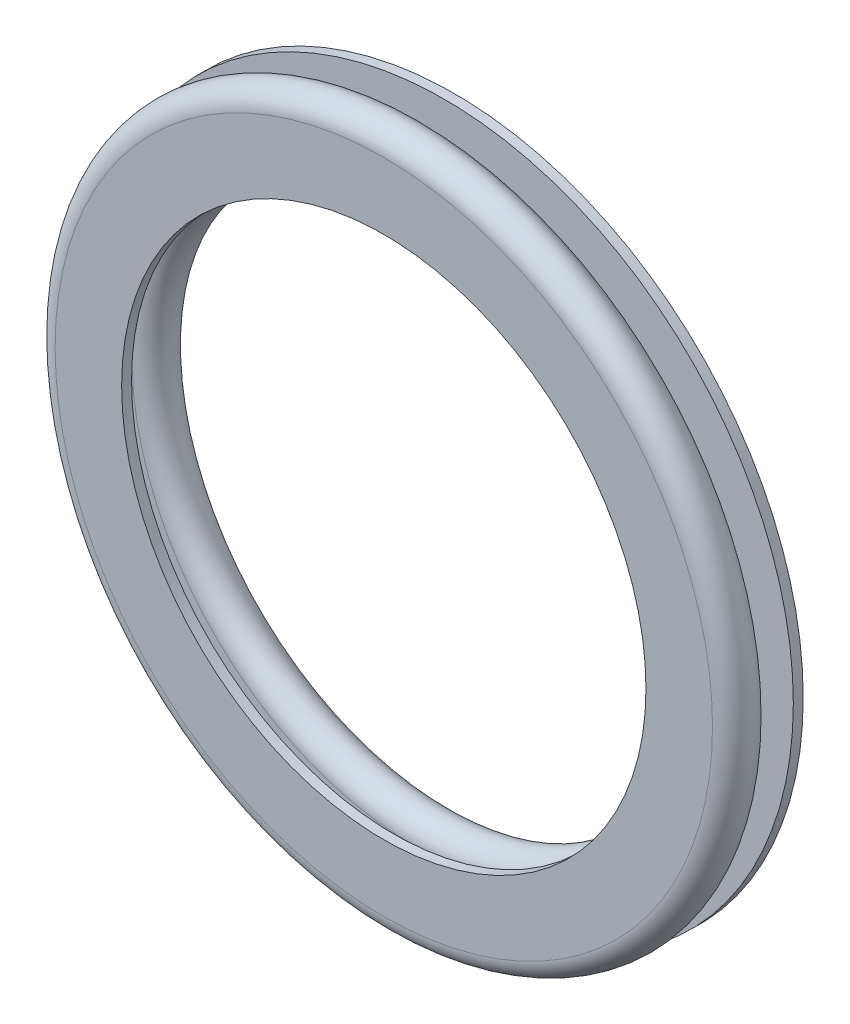
ISO-10303-21;
HEADER;
FILE_DESCRIPTION(('STEP AP214'),'2;1');
FILE_NAME('part.step','',(''),(''),'','','');
FILE_SCHEMA(('AUTOMOTIVE_DESIGN { 1 0 10303 214 1 1 1 1 }'));
ENDSEC;
DATA;
#1=APPLICATION_CONTEXT('core data for automotive mechanical design processes');
#2=APPLICATION_PROTOCOL_DEFINITION('international standard','automotive_design',2000,#1);
#3=PRODUCT_CONTEXT('',#1,'mechanical');
#4=PRODUCT('Part','Part','',(#3));
#5=PRODUCT_RELATED_PRODUCT_CATEGORY('part','',(#4));
#6=PRODUCT_DEFINITION_FORMATION('','',#4);
#7=PRODUCT_DEFINITION_CONTEXT('part definition',#1,'design');
#8=PRODUCT_DEFINITION('design','',#6,#7);
#9=PRODUCT_DEFINITION_SHAPE('','',#8);
#10=(LENGTH_UNIT() NAMED_UNIT(*) SI_UNIT(.MILLI.,.METRE.));
#11=(NAMED_UNIT(*) PLANE_ANGLE_UNIT() SI_UNIT($,.RADIAN.));
#12=(NAMED_UNIT(*) SI_UNIT($,.STERADIAN.) SOLID_ANGLE_UNIT());
#13=UNCERTAINTY_MEASURE_WITH_UNIT(LENGTH_MEASURE(1.E-05),#10,'distance_accuracy_value','');
#14=(GEOMETRIC_REPRESENTATION_CONTEXT(3) GLOBAL_UNCERTAINTY_ASSIGNED_CONTEXT((#13)) GLOBAL_UNIT_ASSIGNED_CONTEXT((#10,
#11,#12)) REPRESENTATION_CONTEXT('',''));
#15=CARTESIAN_POINT('',(0.,0.,0.));
#16=DIRECTION('',(0.,0.,1.));
#17=DIRECTION('',(1.,0.,0.));
#18=AXIS2_PLACEMENT_3D('',#15,#16,#17);
#19=CARTESIAN_POINT('',(0.,0.,0.));
#20=DIRECTION('',(0.,0.,1.));
#21=DIRECTION('',(1.,0.,0.));
#22=AXIS2_PLACEMENT_3D('',#19,#20,#21);
#23=CYLINDRICAL_SURFACE('',#22,6.61);
#24=CARTESIAN_POINT('',(0.,0.,-0.25));
#25=DIRECTION('',(0.,0.,1.));
#26=DIRECTION('',(1.,0.,0.));
#27=AXIS2_PLACEMENT_3D('',#24,#25,#26);
#28=CIRCLE('',#27,6.61);
#29=CARTESIAN_POINT('',(6.61,0.,-0.25));
#30=VERTEX_POINT('',#29);
#31=EDGE_CURVE('E55',#30,#30,#28,.T.);
#32=ORIENTED_EDGE('',*,*,#31,.F.);
#33=EDGE_LOOP('',(#32));
#34=FACE_BOUND('',#33,.T.);
#35=CARTESIAN_POINT('',(0.,0.,0.));
#36=DIRECTION('',(0.,0.,1.));
#37=DIRECTION('',(1.,0.,0.));
#38=AXIS2_PLACEMENT_3D('',#35,#36,#37);
#39=CIRCLE('',#38,6.61);
#40=CARTESIAN_POINT('',(6.61,0.,0.));
#41=VERTEX_POINT('',#40);
#42=EDGE_CURVE('E10',#41,#41,#39,.T.);
#43=ORIENTED_EDGE('',*,*,#42,.T.);
#44=EDGE_LOOP('',(#43));
#45=FACE_BOUND('',#44,.T.);
#46=ADVANCED_FACE('F15',(#34,#45),#23,.F.);
#47=CARTESIAN_POINT('',(0.,6.61,0.));
#48=DIRECTION('',(0.,0.,-1.));
#49=DIRECTION('',(-1.,0.,0.));
#50=AXIS2_PLACEMENT_3D('',#47,#48,#49);
#51=PLANE('',#50);
#52=ORIENTED_EDGE('',*,*,#42,.F.);
#53=EDGE_LOOP('',(#52));
#54=FACE_BOUND('',#53,.T.);
#55=CARTESIAN_POINT('',(0.,0.,0.));
#56=DIRECTION('',(0.,0.,1.));
#57=DIRECTION('',(1.,0.,0.));
#58=AXIS2_PLACEMENT_3D('',#55,#56,#57);
#59=CIRCLE('',#58,8.2875);
#60=CARTESIAN_POINT('',(8.2875,0.,0.));
#61=VERTEX_POINT('',#60);
#62=EDGE_CURVE('E21',#61,#61,#59,.T.);
#63=ORIENTED_EDGE('',*,*,#62,.T.);
#64=EDGE_LOOP('',(#63));
#65=FACE_BOUND('',#64,.T.);
#66=ADVANCED_FACE('F62',(#54,#65),#51,.F.);
#67=CARTESIAN_POINT('',(0.,0.,-0.507500000000003));
#68=DIRECTION('',(0.,0.,1.));
#69=DIRECTION('',(1.,0.,0.));
#70=AXIS2_PLACEMENT_3D('',#67,#68,#69);
#71=TOROIDAL_SURFACE('',#70,8.2875,0.507500000000001);
#72=ORIENTED_EDGE('',*,*,#62,.F.);
#73=EDGE_LOOP('',(#72));
#74=FACE_BOUND('',#73,.T.);
#75=CARTESIAN_POINT('',(0.,0.,-1.015));
#76=DIRECTION('',(0.,0.,1.));
#77=DIRECTION('',(1.,0.,0.));
#78=AXIS2_PLACEMENT_3D('',#75,#76,#77);
#79=CIRCLE('',#78,8.2875);
#80=CARTESIAN_POINT('',(8.2875,0.,-1.015));
#81=VERTEX_POINT('',#80);
#82=EDGE_CURVE('E25',#81,#81,#79,.T.);
#83=ORIENTED_EDGE('',*,*,#82,.T.);
#84=EDGE_LOOP('',(#83));
#85=FACE_BOUND('',#84,.T.);
#86=ADVANCED_FACE('F67',(#74,#85),#71,.T.);
#87=CARTESIAN_POINT('',(0.,8.2875,-1.015));
#88=DIRECTION('',(0.,0.,1.));
#89=DIRECTION('',(1.,0.,0.));
#90=AXIS2_PLACEMENT_3D('',#87,#88,#89);
#91=PLANE('',#90);
#92=ORIENTED_EDGE('',*,*,#82,.F.);
#93=EDGE_LOOP('',(#92));
#94=FACE_BOUND('',#93,.T.);
#95=CARTESIAN_POINT('',(0.,0.,-1.015));
#96=DIRECTION('',(0.,0.,1.));
#97=DIRECTION('',(1.,0.,0.));
#98=AXIS2_PLACEMENT_3D('',#95,#96,#97);
#99=CIRCLE('',#98,7.1175);
#100=CARTESIAN_POINT('',(7.1175,0.,-1.015));
#101=VERTEX_POINT('',#100);
#102=EDGE_CURVE('E29',#101,#101,#99,.T.);
#103=ORIENTED_EDGE('',*,*,#102,.T.);
#104=EDGE_LOOP('',(#103));
#105=FACE_BOUND('',#104,.T.);
#106=ADVANCED_FACE('F72',(#94,#105),#91,.F.);
#107=CARTESIAN_POINT('',(0.,0.,-1.2725));
#108=DIRECTION('',(0.,0.,1.));
#109=DIRECTION('',(1.,0.,0.));
#110=AXIS2_PLACEMENT_3D('',#107,#108,#109);
#111=TOROIDAL_SURFACE('',#110,7.1175,0.257499999999999);
#112=ORIENTED_EDGE('',*,*,#102,.F.);
#113=EDGE_LOOP('',(#112));
#114=FACE_BOUND('',#113,.T.);
#115=CARTESIAN_POINT('',(0.,0.,-1.53));
#116=DIRECTION('',(0.,0.,1.));
#117=DIRECTION('',(1.,0.,0.));
#118=AXIS2_PLACEMENT_3D('',#115,#116,#117);
#119=CIRCLE('',#118,7.1175);
#120=CARTESIAN_POINT('',(7.1175,0.,-1.53));
#121=VERTEX_POINT('',#120);
#122=EDGE_CURVE('E34',#121,#121,#119,.T.);
#123=ORIENTED_EDGE('',*,*,#122,.T.);
#124=EDGE_LOOP('',(#123));
#125=FACE_BOUND('',#124,.T.);
#126=ADVANCED_FACE('F78',(#114,#125),#111,.F.);
#127=CARTESIAN_POINT('',(0.,7.1175,-1.53));
#128=DIRECTION('',(0.,0.,-1.));
#129=DIRECTION('',(-1.,0.,0.));
#130=AXIS2_PLACEMENT_3D('',#127,#128,#129);
#131=PLANE('',#130);
#132=ORIENTED_EDGE('',*,*,#122,.F.);
#133=EDGE_LOOP('',(#132));
#134=FACE_BOUND('',#133,.T.);
#135=CARTESIAN_POINT('',(0.,0.,-1.53));
#136=DIRECTION('',(0.,0.,1.));
#137=DIRECTION('',(1.,0.,0.));
#138=AXIS2_PLACEMENT_3D('',#135,#136,#137);
#139=CIRCLE('',#138,8.795);
#140=CARTESIAN_POINT('',(8.795,0.,-1.53));
#141=VERTEX_POINT('',#140);
#142=EDGE_CURVE('E37',#141,#141,#139,.T.);
#143=ORIENTED_EDGE('',*,*,#142,.T.);
#144=EDGE_LOOP('',(#143));
#145=FACE_BOUND('',#144,.T.);
#146=ADVANCED_FACE('F82',(#134,#145),#131,.F.);
#147=CARTESIAN_POINT('',(0.,0.,0.));
#148=DIRECTION('',(0.,0.,1.));
#149=DIRECTION('',(1.,0.,0.));
#150=AXIS2_PLACEMENT_3D('',#147,#148,#149);
#151=CYLINDRICAL_SURFACE('',#150,8.795);
#152=ORIENTED_EDGE('',*,*,#142,.F.);
#153=EDGE_LOOP('',(#152));
#154=FACE_BOUND('',#153,.T.);
#155=CARTESIAN_POINT('',(0.,0.,-1.78));
#156=DIRECTION('',(0.,0.,1.));
#157=DIRECTION('',(1.,0.,0.));
#158=AXIS2_PLACEMENT_3D('',#155,#156,#157);
#159=CIRCLE('',#158,8.795);
#160=CARTESIAN_POINT('',(8.795,0.,-1.78));
#161=VERTEX_POINT('',#160);
#162=EDGE_CURVE('E40',#161,#161,#159,.T.);
#163=ORIENTED_EDGE('',*,*,#162,.T.);
#164=EDGE_LOOP('',(#163));
#165=FACE_BOUND('',#164,.T.);
#166=ADVANCED_FACE('F86',(#154,#165),#151,.T.);
#167=CARTESIAN_POINT('',(0.,7.1175,-1.78));
#168=DIRECTION('',(0.,0.,1.));
#169=DIRECTION('',(1.,0.,0.));
#170=AXIS2_PLACEMENT_3D('',#167,#168,#169);
#171=PLANE('',#170);
#172=ORIENTED_EDGE('',*,*,#162,.F.);
#173=EDGE_LOOP('',(#172));
#174=FACE_BOUND('',#173,.T.);
#175=CARTESIAN_POINT('',(0.,0.,-1.78));
#176=DIRECTION('',(0.,0.,1.));
#177=DIRECTION('',(1.,0.,0.));
#178=AXIS2_PLACEMENT_3D('',#175,#176,#177);
#179=CIRCLE('',#178,7.1175);
#180=CARTESIAN_POINT('',(7.1175,0.,-1.78));
#181=VERTEX_POINT('',#180);
#182=EDGE_CURVE('E43',#181,#181,#179,.T.);
#183=ORIENTED_EDGE('',*,*,#182,.T.);
#184=EDGE_LOOP('',(#183));
#185=FACE_BOUND('',#184,.T.);
#186=ADVANCED_FACE('F90',(#174,#185),#171,.F.);
#187=CARTESIAN_POINT('',(0.,0.,-1.2725));
#188=DIRECTION('',(0.,0.,1.));
#189=DIRECTION('',(1.,0.,0.));
#190=AXIS2_PLACEMENT_3D('',#187,#188,#189);
#191=TOROIDAL_SURFACE('',#190,7.1175,0.5075);
#192=ORIENTED_EDGE('',*,*,#182,.F.);
#193=EDGE_LOOP('',(#192));
#194=FACE_BOUND('',#193,.T.);
#195=CARTESIAN_POINT('',(0.,0.,-0.765000000000004));
#196=DIRECTION('',(0.,0.,1.));
#197=DIRECTION('',(1.,0.,0.));
#198=AXIS2_PLACEMENT_3D('',#195,#196,#197);
#199=CIRCLE('',#198,7.1175);
#200=CARTESIAN_POINT('',(7.1175,0.,-0.765000000000004));
#201=VERTEX_POINT('',#200);
#202=EDGE_CURVE('E46',#201,#201,#199,.T.);
#203=ORIENTED_EDGE('',*,*,#202,.T.);
#204=EDGE_LOOP('',(#203));
#205=FACE_BOUND('',#204,.T.);
#206=ADVANCED_FACE('F94',(#194,#205),#191,.T.);
#207=CARTESIAN_POINT('',(0.,8.2875,-0.765000000000004));
#208=DIRECTION('',(0.,0.,-1.));
#209=DIRECTION('',(-1.,0.,0.));
#210=AXIS2_PLACEMENT_3D('',#207,#208,#209);
#211=PLANE('',#210);
#212=ORIENTED_EDGE('',*,*,#202,.F.);
#213=EDGE_LOOP('',(#212));
#214=FACE_BOUND('',#213,.T.);
#215=CARTESIAN_POINT('',(0.,0.,-0.765000000000004));
#216=DIRECTION('',(0.,0.,1.));
#217=DIRECTION('',(1.,0.,0.));
#218=AXIS2_PLACEMENT_3D('',#215,#216,#217);
#219=CIRCLE('',#218,8.2875);
#220=CARTESIAN_POINT('',(8.2875,0.,-0.765000000000004));
#221=VERTEX_POINT('',#220);
#222=EDGE_CURVE('E49',#221,#221,#219,.T.);
#223=ORIENTED_EDGE('',*,*,#222,.T.);
#224=EDGE_LOOP('',(#223));
#225=FACE_BOUND('',#224,.T.);
#226=ADVANCED_FACE('F98',(#214,#225),#211,.F.);
#227=CARTESIAN_POINT('',(0.,0.,-0.507500000000003));
#228=DIRECTION('',(0.,0.,1.));
#229=DIRECTION('',(1.,0.,0.));
#230=AXIS2_PLACEMENT_3D('',#227,#228,#229);
#231=TOROIDAL_SURFACE('',#230,8.2875,0.257500000000002);
#232=ORIENTED_EDGE('',*,*,#222,.F.);
#233=EDGE_LOOP('',(#232));
#234=FACE_BOUND('',#233,.T.);
#235=CARTESIAN_POINT('',(0.,0.,-0.250000000000001));
#236=DIRECTION('',(0.,0.,1.));
#237=DIRECTION('',(1.,0.,0.));
#238=AXIS2_PLACEMENT_3D('',#235,#236,#237);
#239=CIRCLE('',#238,8.2875);
#240=CARTESIAN_POINT('',(8.2875,0.,-0.250000000000001));
#241=VERTEX_POINT('',#240);
#242=EDGE_CURVE('E52',#241,#241,#239,.T.);
#243=ORIENTED_EDGE('',*,*,#242,.T.);
#244=EDGE_LOOP('',(#243));
#245=FACE_BOUND('',#244,.T.);
#246=ADVANCED_FACE('F102',(#234,#245),#231,.F.);
#247=CARTESIAN_POINT('',(0.,6.61,-0.250000000000001));
#248=DIRECTION('',(0.,0.,1.));
#249=DIRECTION('',(1.,0.,0.));
#250=AXIS2_PLACEMENT_3D('',#247,#248,#249);
#251=PLANE('',#250);
#252=ORIENTED_EDGE('',*,*,#242,.F.);
#253=EDGE_LOOP('',(#252));
#254=FACE_BOUND('',#253,.T.);
#255=ORIENTED_EDGE('',*,*,#31,.T.);
#256=EDGE_LOOP('',(#255));
#257=FACE_BOUND('',#256,.T.);
#258=ADVANCED_FACE('F59',(#254,#257),#251,.F.);
#259=CLOSED_SHELL('',(#46,#66,#86,#106,#126,#146,#166,#186,#206,#226,#246,#258));
#260=MANIFOLD_SOLID_BREP('B1',#259);
#261=ADVANCED_BREP_SHAPE_REPRESENTATION('',(#18,#260),#14);
#262=SHAPE_DEFINITION_REPRESENTATION(#9,#261);
ENDSEC;
END-ISO-10303-21;
